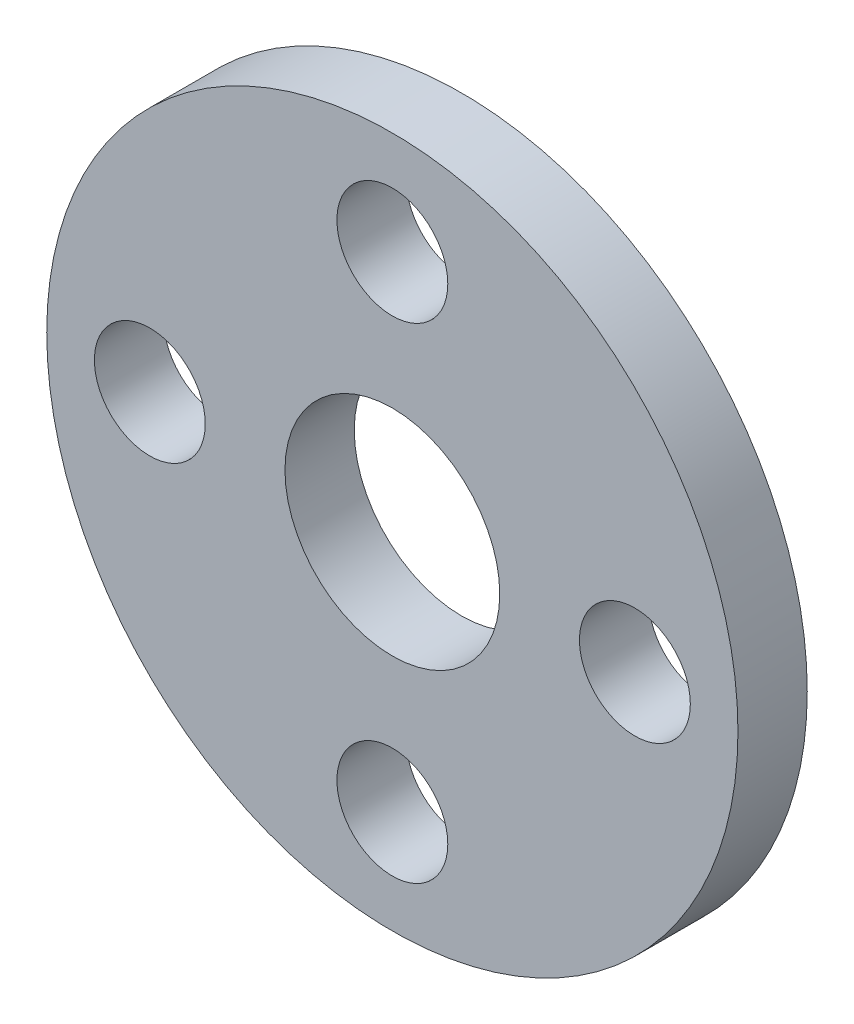
ISO-10303-21;
HEADER;
FILE_DESCRIPTION(('STEP AP214'),'2;1');
FILE_NAME('part.step','',(''),(''),'','','');
FILE_SCHEMA(('AUTOMOTIVE_DESIGN { 1 0 10303 214 1 1 1 1 }'));
ENDSEC;
DATA;
#1=APPLICATION_CONTEXT('core data for automotive mechanical design processes');
#2=APPLICATION_PROTOCOL_DEFINITION('international standard','automotive_design',2000,#1);
#3=PRODUCT_CONTEXT('',#1,'mechanical');
#4=PRODUCT('Part','Part','',(#3));
#5=PRODUCT_RELATED_PRODUCT_CATEGORY('part','',(#4));
#6=PRODUCT_DEFINITION_FORMATION('','',#4);
#7=PRODUCT_DEFINITION_CONTEXT('part definition',#1,'design');
#8=PRODUCT_DEFINITION('design','',#6,#7);
#9=PRODUCT_DEFINITION_SHAPE('','',#8);
#10=(LENGTH_UNIT() NAMED_UNIT(*) SI_UNIT(.MILLI.,.METRE.));
#11=(NAMED_UNIT(*) PLANE_ANGLE_UNIT() SI_UNIT($,.RADIAN.));
#12=(NAMED_UNIT(*) SI_UNIT($,.STERADIAN.) SOLID_ANGLE_UNIT());
#13=UNCERTAINTY_MEASURE_WITH_UNIT(LENGTH_MEASURE(1.E-05),#10,'distance_accuracy_value','');
#14=(GEOMETRIC_REPRESENTATION_CONTEXT(3) GLOBAL_UNCERTAINTY_ASSIGNED_CONTEXT((#13)) GLOBAL_UNIT_ASSIGNED_CONTEXT((#10,
#11,#12)) REPRESENTATION_CONTEXT('',''));
#15=CARTESIAN_POINT('',(0.,0.,0.));
#16=DIRECTION('',(0.,0.,1.));
#17=DIRECTION('',(1.,0.,0.));
#18=AXIS2_PLACEMENT_3D('',#15,#16,#17);
#19=CARTESIAN_POINT('',(0.,7.,0.));
#20=DIRECTION('',(0.,0.,1.));
#21=DIRECTION('',(1.,0.,0.));
#22=AXIS2_PLACEMENT_3D('',#19,#20,#21);
#23=CYLINDRICAL_SURFACE('',#22,1.6);
#24=CARTESIAN_POINT('',(0.,7.,2.));
#25=DIRECTION('',(0.,0.,1.));
#26=DIRECTION('',(1.,0.,0.));
#27=AXIS2_PLACEMENT_3D('',#24,#25,#26);
#28=CIRCLE('',#27,1.6);
#29=CARTESIAN_POINT('',(1.6,7.,2.));
#30=VERTEX_POINT('',#29);
#31=EDGE_CURVE('E44',#30,#30,#28,.T.);
#32=ORIENTED_EDGE('',*,*,#31,.T.);
#33=EDGE_LOOP('',(#32));
#34=FACE_BOUND('',#33,.T.);
#35=CARTESIAN_POINT('',(0.,7.,0.));
#36=DIRECTION('',(0.,0.,1.));
#37=DIRECTION('',(1.,0.,0.));
#38=AXIS2_PLACEMENT_3D('',#35,#36,#37);
#39=CIRCLE('',#38,1.6);
#40=CARTESIAN_POINT('',(1.6,7.,0.));
#41=VERTEX_POINT('',#40);
#42=EDGE_CURVE('E9',#41,#41,#39,.T.);
#43=ORIENTED_EDGE('',*,*,#42,.F.);
#44=EDGE_LOOP('',(#43));
#45=FACE_BOUND('',#44,.T.);
#46=ADVANCED_FACE('F14',(#34,#45),#23,.F.);
#47=CARTESIAN_POINT('',(7.,0.,0.));
#48=DIRECTION('',(0.,0.,1.));
#49=DIRECTION('',(1.,0.,0.));
#50=AXIS2_PLACEMENT_3D('',#47,#48,#49);
#51=CYLINDRICAL_SURFACE('',#50,1.6);
#52=CARTESIAN_POINT('',(7.,0.,2.));
#53=DIRECTION('',(0.,0.,1.));
#54=DIRECTION('',(1.,0.,0.));
#55=AXIS2_PLACEMENT_3D('',#52,#53,#54);
#56=CIRCLE('',#55,1.6);
#57=CARTESIAN_POINT('',(8.6,0.,2.));
#58=VERTEX_POINT('',#57);
#59=EDGE_CURVE('E51',#58,#58,#56,.T.);
#60=ORIENTED_EDGE('',*,*,#59,.T.);
#61=EDGE_LOOP('',(#60));
#62=FACE_BOUND('',#61,.T.);
#63=CARTESIAN_POINT('',(7.,0.,0.));
#64=DIRECTION('',(0.,0.,1.));
#65=DIRECTION('',(1.,0.,0.));
#66=AXIS2_PLACEMENT_3D('',#63,#64,#65);
#67=CIRCLE('',#66,1.6);
#68=CARTESIAN_POINT('',(8.6,0.,0.));
#69=VERTEX_POINT('',#68);
#70=EDGE_CURVE('E21',#69,#69,#67,.T.);
#71=ORIENTED_EDGE('',*,*,#70,.F.);
#72=EDGE_LOOP('',(#71));
#73=FACE_BOUND('',#72,.T.);
#74=ADVANCED_FACE('F101',(#62,#73),#51,.F.);
#75=CARTESIAN_POINT('',(0.,0.,0.));
#76=DIRECTION('',(0.,0.,1.));
#77=DIRECTION('',(1.,0.,0.));
#78=AXIS2_PLACEMENT_3D('',#75,#76,#77);
#79=CYLINDRICAL_SURFACE('',#78,3.1);
#80=CARTESIAN_POINT('',(0.,0.,2.));
#81=DIRECTION('',(0.,0.,1.));
#82=DIRECTION('',(1.,0.,0.));
#83=AXIS2_PLACEMENT_3D('',#80,#81,#82);
#84=CIRCLE('',#83,3.1);
#85=CARTESIAN_POINT('',(3.1,0.,2.));
#86=VERTEX_POINT('',#85);
#87=EDGE_CURVE('E54',#86,#86,#84,.T.);
#88=ORIENTED_EDGE('',*,*,#87,.T.);
#89=EDGE_LOOP('',(#88));
#90=FACE_BOUND('',#89,.T.);
#91=CARTESIAN_POINT('',(0.,0.,0.));
#92=DIRECTION('',(0.,0.,1.));
#93=DIRECTION('',(1.,0.,0.));
#94=AXIS2_PLACEMENT_3D('',#91,#92,#93);
#95=CIRCLE('',#94,3.1);
#96=CARTESIAN_POINT('',(3.1,0.,0.));
#97=VERTEX_POINT('',#96);
#98=EDGE_CURVE('E30',#97,#97,#95,.T.);
#99=ORIENTED_EDGE('',*,*,#98,.F.);
#100=EDGE_LOOP('',(#99));
#101=FACE_BOUND('',#100,.T.);
#102=ADVANCED_FACE('F106',(#90,#101),#79,.F.);
#103=CARTESIAN_POINT('',(-7.,0.,0.));
#104=DIRECTION('',(0.,0.,1.));
#105=DIRECTION('',(1.,0.,0.));
#106=AXIS2_PLACEMENT_3D('',#103,#104,#105);
#107=CYLINDRICAL_SURFACE('',#106,1.6);
#108=CARTESIAN_POINT('',(-7.,0.,2.));
#109=DIRECTION('',(0.,0.,1.));
#110=DIRECTION('',(1.,0.,0.));
#111=AXIS2_PLACEMENT_3D('',#108,#109,#110);
#112=CIRCLE('',#111,1.6);
#113=CARTESIAN_POINT('',(-5.4,0.,2.));
#114=VERTEX_POINT('',#113);
#115=EDGE_CURVE('E59',#114,#114,#112,.T.);
#116=ORIENTED_EDGE('',*,*,#115,.T.);
#117=EDGE_LOOP('',(#116));
#118=FACE_BOUND('',#117,.T.);
#119=CARTESIAN_POINT('',(-7.,0.,0.));
#120=DIRECTION('',(0.,0.,1.));
#121=DIRECTION('',(1.,0.,0.));
#122=AXIS2_PLACEMENT_3D('',#119,#120,#121);
#123=CIRCLE('',#122,1.6);
#124=CARTESIAN_POINT('',(-5.4,0.,0.));
#125=VERTEX_POINT('',#124);
#126=EDGE_CURVE('E37',#125,#125,#123,.T.);
#127=ORIENTED_EDGE('',*,*,#126,.F.);
#128=EDGE_LOOP('',(#127));
#129=FACE_BOUND('',#128,.T.);
#130=ADVANCED_FACE('F97',(#118,#129),#107,.F.);
#131=CARTESIAN_POINT('',(0.,-7.,0.));
#132=DIRECTION('',(0.,0.,1.));
#133=DIRECTION('',(1.,0.,0.));
#134=AXIS2_PLACEMENT_3D('',#131,#132,#133);
#135=CYLINDRICAL_SURFACE('',#134,1.6);
#136=CARTESIAN_POINT('',(0.,-7.,2.));
#137=DIRECTION('',(0.,0.,1.));
#138=DIRECTION('',(1.,0.,0.));
#139=AXIS2_PLACEMENT_3D('',#136,#137,#138);
#140=CIRCLE('',#139,1.6);
#141=CARTESIAN_POINT('',(1.6,-7.,2.));
#142=VERTEX_POINT('',#141);
#143=EDGE_CURVE('E63',#142,#142,#140,.T.);
#144=ORIENTED_EDGE('',*,*,#143,.T.);
#145=EDGE_LOOP('',(#144));
#146=FACE_BOUND('',#145,.T.);
#147=CARTESIAN_POINT('',(0.,-7.,0.));
#148=DIRECTION('',(0.,0.,1.));
#149=DIRECTION('',(1.,0.,0.));
#150=AXIS2_PLACEMENT_3D('',#147,#148,#149);
#151=CIRCLE('',#150,1.6);
#152=CARTESIAN_POINT('',(1.6,-7.,0.));
#153=VERTEX_POINT('',#152);
#154=EDGE_CURVE('E40',#153,#153,#151,.T.);
#155=ORIENTED_EDGE('',*,*,#154,.F.);
#156=EDGE_LOOP('',(#155));
#157=FACE_BOUND('',#156,.T.);
#158=ADVANCED_FACE('F88',(#146,#157),#135,.F.);
#159=CARTESIAN_POINT('',(0.,0.,0.));
#160=DIRECTION('',(0.,0.,1.));
#161=DIRECTION('',(1.,0.,0.));
#162=AXIS2_PLACEMENT_3D('',#159,#160,#161);
#163=PLANE('',#162);
#164=ORIENTED_EDGE('',*,*,#42,.T.);
#165=EDGE_LOOP('',(#164));
#166=FACE_BOUND('',#165,.T.);
#167=ORIENTED_EDGE('',*,*,#70,.T.);
#168=EDGE_LOOP('',(#167));
#169=FACE_BOUND('',#168,.T.);
#170=ORIENTED_EDGE('',*,*,#98,.T.);
#171=EDGE_LOOP('',(#170));
#172=FACE_BOUND('',#171,.T.);
#173=ORIENTED_EDGE('',*,*,#126,.T.);
#174=EDGE_LOOP('',(#173));
#175=FACE_BOUND('',#174,.T.);
#176=ORIENTED_EDGE('',*,*,#154,.T.);
#177=EDGE_LOOP('',(#176));
#178=FACE_BOUND('',#177,.T.);
#179=CARTESIAN_POINT('',(0.,0.,0.));
#180=DIRECTION('',(0.,0.,1.));
#181=DIRECTION('',(1.,0.,0.));
#182=AXIS2_PLACEMENT_3D('',#179,#180,#181);
#183=CIRCLE('',#182,9.975);
#184=CARTESIAN_POINT('',(9.975,0.,0.));
#185=VERTEX_POINT('',#184);
#186=EDGE_CURVE('E67',#185,#185,#183,.T.);
#187=ORIENTED_EDGE('',*,*,#186,.F.);
#188=EDGE_LOOP('',(#187));
#189=FACE_BOUND('',#188,.T.);
#190=ADVANCED_FACE('F86',(#166,#169,#172,#175,#178,#189),#163,.F.);
#191=CARTESIAN_POINT('',(0.,0.,2.));
#192=DIRECTION('',(0.,0.,1.));
#193=DIRECTION('',(1.,0.,0.));
#194=AXIS2_PLACEMENT_3D('',#191,#192,#193);
#195=PLANE('',#194);
#196=ORIENTED_EDGE('',*,*,#31,.F.);
#197=EDGE_LOOP('',(#196));
#198=FACE_BOUND('',#197,.T.);
#199=ORIENTED_EDGE('',*,*,#59,.F.);
#200=EDGE_LOOP('',(#199));
#201=FACE_BOUND('',#200,.T.);
#202=ORIENTED_EDGE('',*,*,#87,.F.);
#203=EDGE_LOOP('',(#202));
#204=FACE_BOUND('',#203,.T.);
#205=ORIENTED_EDGE('',*,*,#115,.F.);
#206=EDGE_LOOP('',(#205));
#207=FACE_BOUND('',#206,.T.);
#208=ORIENTED_EDGE('',*,*,#143,.F.);
#209=EDGE_LOOP('',(#208));
#210=FACE_BOUND('',#209,.T.);
#211=CARTESIAN_POINT('',(0.,0.,2.));
#212=DIRECTION('',(0.,0.,1.));
#213=DIRECTION('',(1.,0.,0.));
#214=AXIS2_PLACEMENT_3D('',#211,#212,#213);
#215=CIRCLE('',#214,9.975);
#216=CARTESIAN_POINT('',(9.975,0.,2.));
#217=VERTEX_POINT('',#216);
#218=EDGE_CURVE('E71',#217,#217,#215,.T.);
#219=ORIENTED_EDGE('',*,*,#218,.T.);
#220=EDGE_LOOP('',(#219));
#221=FACE_BOUND('',#220,.T.);
#222=ADVANCED_FACE('F78',(#198,#201,#204,#207,#210,#221),#195,.T.);
#223=CARTESIAN_POINT('',(0.,0.,0.));
#224=DIRECTION('',(0.,0.,1.));
#225=DIRECTION('',(1.,0.,0.));
#226=AXIS2_PLACEMENT_3D('',#223,#224,#225);
#227=CYLINDRICAL_SURFACE('',#226,9.975);
#228=ORIENTED_EDGE('',*,*,#218,.F.);
#229=EDGE_LOOP('',(#228));
#230=FACE_BOUND('',#229,.T.);
#231=ORIENTED_EDGE('',*,*,#186,.T.);
#232=EDGE_LOOP('',(#231));
#233=FACE_BOUND('',#232,.T.);
#234=ADVANCED_FACE('F80',(#230,#233),#227,.T.);
#235=CLOSED_SHELL('',(#46,#74,#102,#130,#158,#190,#222,#234));
#236=MANIFOLD_SOLID_BREP('B1',#235);
#237=ADVANCED_BREP_SHAPE_REPRESENTATION('',(#18,#236),#14);
#238=SHAPE_DEFINITION_REPRESENTATION(#9,#237);
ENDSEC;
END-ISO-10303-21;
